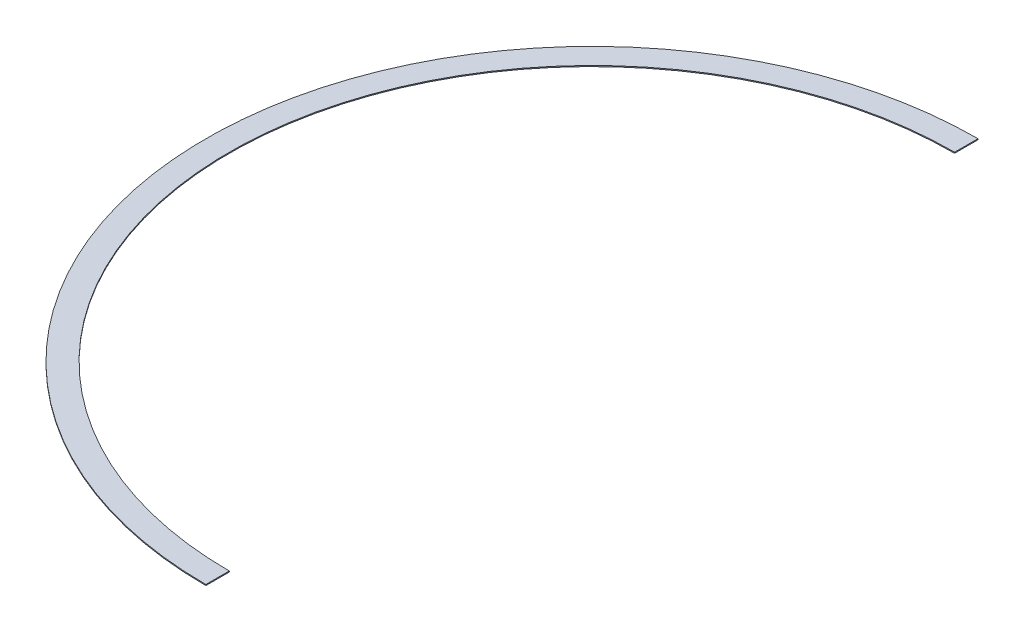
ISO-10303-21;
HEADER;
FILE_DESCRIPTION(('STEP AP214'),'2;1');
FILE_NAME('part.step','',(''),(''),'','','');
FILE_SCHEMA(('AUTOMOTIVE_DESIGN { 1 0 10303 214 1 1 1 1 }'));
ENDSEC;
DATA;
#1=APPLICATION_CONTEXT('core data for automotive mechanical design processes');
#2=APPLICATION_PROTOCOL_DEFINITION('international standard','automotive_design',2000,#1);
#3=PRODUCT_CONTEXT('',#1,'mechanical');
#4=PRODUCT('Part','Part','',(#3));
#5=PRODUCT_RELATED_PRODUCT_CATEGORY('part','',(#4));
#6=PRODUCT_DEFINITION_FORMATION('','',#4);
#7=PRODUCT_DEFINITION_CONTEXT('part definition',#1,'design');
#8=PRODUCT_DEFINITION('design','',#6,#7);
#9=PRODUCT_DEFINITION_SHAPE('','',#8);
#10=(LENGTH_UNIT() NAMED_UNIT(*) SI_UNIT(.MILLI.,.METRE.));
#11=(NAMED_UNIT(*) PLANE_ANGLE_UNIT() SI_UNIT($,.RADIAN.));
#12=(NAMED_UNIT(*) SI_UNIT($,.STERADIAN.) SOLID_ANGLE_UNIT());
#13=UNCERTAINTY_MEASURE_WITH_UNIT(LENGTH_MEASURE(1.E-05),#10,'distance_accuracy_value','');
#14=(GEOMETRIC_REPRESENTATION_CONTEXT(3) GLOBAL_UNCERTAINTY_ASSIGNED_CONTEXT((#13)) GLOBAL_UNIT_ASSIGNED_CONTEXT((#10,
#11,#12)) REPRESENTATION_CONTEXT('',''));
#15=CARTESIAN_POINT('',(0.,0.,0.));
#16=DIRECTION('',(0.,0.,1.));
#17=DIRECTION('',(1.,0.,0.));
#18=AXIS2_PLACEMENT_3D('',#15,#16,#17);
#19=CARTESIAN_POINT('',(0.,0.79375,0.));
#20=DIRECTION('',(0.,-1.,0.));
#21=DIRECTION('',(0.,0.,-1.));
#22=AXIS2_PLACEMENT_3D('',#19,#20,#21);
#23=CYLINDRICAL_SURFACE('',#22,314.325);
#24=CARTESIAN_POINT('',(0.,0.,0.));
#25=DIRECTION('',(0.,1.,0.));
#26=DIRECTION('',(1.,0.,0.));
#27=AXIS2_PLACEMENT_3D('',#24,#25,#26);
#28=CIRCLE('',#27,314.325);
#29=CARTESIAN_POINT('',(0.,0.,-314.325));
#30=VERTEX_POINT('',#29);
#31=CARTESIAN_POINT('',(0.,0.,314.325));
#32=VERTEX_POINT('',#31);
#33=EDGE_CURVE('E96',#30,#32,#28,.T.);
#34=ORIENTED_EDGE('',*,*,#33,.T.);
#35=DIRECTION('',(0.,-1.,0.));
#36=VECTOR('',#35,1.);
#37=CARTESIAN_POINT('',(0.,0.79375,314.325));
#38=LINE('',#37,#36);
#39=CARTESIAN_POINT('',(0.,0.79375,314.325));
#40=VERTEX_POINT('',#39);
#41=EDGE_CURVE('E11',#40,#32,#38,.T.);
#42=ORIENTED_EDGE('',*,*,#41,.F.);
#43=CARTESIAN_POINT('',(0.,0.79375,0.));
#44=DIRECTION('',(0.,1.,0.));
#45=DIRECTION('',(1.,0.,0.));
#46=AXIS2_PLACEMENT_3D('',#43,#44,#45);
#47=CIRCLE('',#46,314.325);
#48=CARTESIAN_POINT('',(0.,0.79375,-314.325));
#49=VERTEX_POINT('',#48);
#50=EDGE_CURVE('E73',#49,#40,#47,.T.);
#51=ORIENTED_EDGE('',*,*,#50,.F.);
#52=DIRECTION('',(0.,-1.,0.));
#53=VECTOR('',#52,1.);
#54=CARTESIAN_POINT('',(0.,0.79375,-314.325));
#55=LINE('',#54,#53);
#56=EDGE_CURVE('E49',#49,#30,#55,.T.);
#57=ORIENTED_EDGE('',*,*,#56,.T.);
#58=EDGE_LOOP('',(#34,#42,#51,#57));
#59=FACE_BOUND('',#58,.T.);
#60=ADVANCED_FACE('F33',(#59),#23,.T.);
#61=CARTESIAN_POINT('',(0.,0.79375,295.275));
#62=DIRECTION('',(1.,0.,0.));
#63=DIRECTION('',(0.,0.,-1.));
#64=AXIS2_PLACEMENT_3D('',#61,#62,#63);
#65=PLANE('',#64);
#66=DIRECTION('',(0.,0.,1.));
#67=VECTOR('',#66,1.);
#68=CARTESIAN_POINT('',(0.,0.,295.275));
#69=LINE('',#68,#67);
#70=CARTESIAN_POINT('',(0.,0.,295.275));
#71=VERTEX_POINT('',#70);
#72=EDGE_CURVE('E82',#71,#32,#69,.T.);
#73=ORIENTED_EDGE('',*,*,#72,.F.);
#74=DIRECTION('',(0.,-1.,0.));
#75=VECTOR('',#74,1.);
#76=CARTESIAN_POINT('',(0.,0.79375,295.275));
#77=LINE('',#76,#75);
#78=CARTESIAN_POINT('',(0.,0.79375,295.275));
#79=VERTEX_POINT('',#78);
#80=EDGE_CURVE('E41',#79,#71,#77,.T.);
#81=ORIENTED_EDGE('',*,*,#80,.F.);
#82=DIRECTION('',(0.,0.,1.));
#83=VECTOR('',#82,1.);
#84=CARTESIAN_POINT('',(0.,0.79375,295.275));
#85=LINE('',#84,#83);
#86=EDGE_CURVE('E80',#79,#40,#85,.T.);
#87=ORIENTED_EDGE('',*,*,#86,.T.);
#88=ORIENTED_EDGE('',*,*,#41,.T.);
#89=EDGE_LOOP('',(#73,#81,#87,#88));
#90=FACE_BOUND('',#89,.T.);
#91=ADVANCED_FACE('F79',(#90),#65,.T.);
#92=CARTESIAN_POINT('',(0.,0.79375,0.));
#93=DIRECTION('',(0.,-1.,0.));
#94=DIRECTION('',(0.,0.,-1.));
#95=AXIS2_PLACEMENT_3D('',#92,#93,#94);
#96=CYLINDRICAL_SURFACE('',#95,295.275);
#97=CARTESIAN_POINT('',(0.,0.,0.));
#98=DIRECTION('',(0.,1.,0.));
#99=DIRECTION('',(1.,0.,0.));
#100=AXIS2_PLACEMENT_3D('',#97,#98,#99);
#101=CIRCLE('',#100,295.275);
#102=CARTESIAN_POINT('',(0.,0.,-295.275));
#103=VERTEX_POINT('',#102);
#104=EDGE_CURVE('E99',#103,#71,#101,.T.);
#105=ORIENTED_EDGE('',*,*,#104,.F.);
#106=DIRECTION('',(0.,-1.,0.));
#107=VECTOR('',#106,1.);
#108=CARTESIAN_POINT('',(0.,0.79375,-295.275));
#109=LINE('',#108,#107);
#110=CARTESIAN_POINT('',(0.,0.79375,-295.275));
#111=VERTEX_POINT('',#110);
#112=EDGE_CURVE('E62',#111,#103,#109,.T.);
#113=ORIENTED_EDGE('',*,*,#112,.F.);
#114=CARTESIAN_POINT('',(0.,0.79375,0.));
#115=DIRECTION('',(0.,1.,0.));
#116=DIRECTION('',(1.,0.,0.));
#117=AXIS2_PLACEMENT_3D('',#114,#115,#116);
#118=CIRCLE('',#117,295.275);
#119=EDGE_CURVE('E88',#111,#79,#118,.T.);
#120=ORIENTED_EDGE('',*,*,#119,.T.);
#121=ORIENTED_EDGE('',*,*,#80,.T.);
#122=EDGE_LOOP('',(#105,#113,#120,#121));
#123=FACE_BOUND('',#122,.T.);
#124=ADVANCED_FACE('F90',(#123),#96,.F.);
#125=CARTESIAN_POINT('',(0.,0.79375,-314.325));
#126=DIRECTION('',(1.,0.,0.));
#127=DIRECTION('',(0.,0.,-1.));
#128=AXIS2_PLACEMENT_3D('',#125,#126,#127);
#129=PLANE('',#128);
#130=DIRECTION('',(0.,0.,1.));
#131=VECTOR('',#130,1.);
#132=CARTESIAN_POINT('',(0.,0.,-314.325));
#133=LINE('',#132,#131);
#134=EDGE_CURVE('E101',#30,#103,#133,.T.);
#135=ORIENTED_EDGE('',*,*,#134,.F.);
#136=ORIENTED_EDGE('',*,*,#56,.F.);
#137=DIRECTION('',(0.,0.,1.));
#138=VECTOR('',#137,1.);
#139=CARTESIAN_POINT('',(0.,0.79375,-314.325));
#140=LINE('',#139,#138);
#141=EDGE_CURVE('E91',#49,#111,#140,.T.);
#142=ORIENTED_EDGE('',*,*,#141,.T.);
#143=ORIENTED_EDGE('',*,*,#112,.T.);
#144=EDGE_LOOP('',(#135,#136,#142,#143));
#145=FACE_BOUND('',#144,.T.);
#146=ADVANCED_FACE('F107',(#145),#129,.T.);
#147=CARTESIAN_POINT('',(0.,0.79375,0.));
#148=DIRECTION('',(0.,1.,0.));
#149=DIRECTION('',(0.,0.,1.));
#150=AXIS2_PLACEMENT_3D('',#147,#148,#149);
#151=PLANE('',#150);
#152=ORIENTED_EDGE('',*,*,#50,.T.);
#153=ORIENTED_EDGE('',*,*,#86,.F.);
#154=ORIENTED_EDGE('',*,*,#119,.F.);
#155=ORIENTED_EDGE('',*,*,#141,.F.);
#156=EDGE_LOOP('',(#152,#153,#154,#155));
#157=FACE_BOUND('',#156,.T.);
#158=ADVANCED_FACE('F87',(#157),#151,.T.);
#159=CARTESIAN_POINT('',(0.,0.,0.));
#160=DIRECTION('',(0.,1.,0.));
#161=DIRECTION('',(0.,0.,1.));
#162=AXIS2_PLACEMENT_3D('',#159,#160,#161);
#163=PLANE('',#162);
#164=ORIENTED_EDGE('',*,*,#33,.F.);
#165=ORIENTED_EDGE('',*,*,#134,.T.);
#166=ORIENTED_EDGE('',*,*,#104,.T.);
#167=ORIENTED_EDGE('',*,*,#72,.T.);
#168=EDGE_LOOP('',(#164,#165,#166,#167));
#169=FACE_BOUND('',#168,.T.);
#170=ADVANCED_FACE('F106',(#169),#163,.F.);
#171=CLOSED_SHELL('',(#60,#91,#124,#146,#158,#170));
#172=MANIFOLD_SOLID_BREP('B2',#171);
#173=ADVANCED_BREP_SHAPE_REPRESENTATION('',(#18,#172),#14);
#174=SHAPE_DEFINITION_REPRESENTATION(#9,#173);
ENDSEC;
END-ISO-10303-21;
